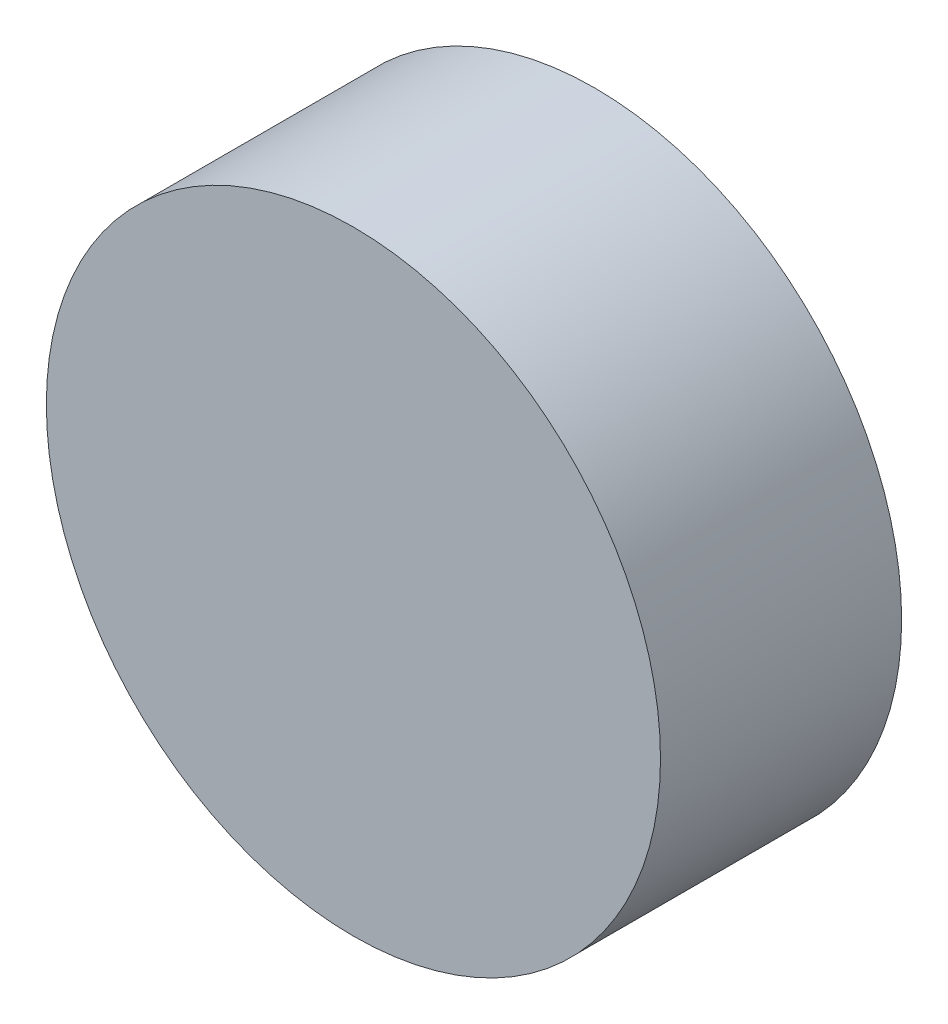
ISO-10303-21;
HEADER;
FILE_DESCRIPTION(('STEP AP214'),'2;1');
FILE_NAME('part.step','',(''),(''),'','','');
FILE_SCHEMA(('AUTOMOTIVE_DESIGN { 1 0 10303 214 1 1 1 1 }'));
ENDSEC;
DATA;
#1=APPLICATION_CONTEXT('core data for automotive mechanical design processes');
#2=APPLICATION_PROTOCOL_DEFINITION('international standard','automotive_design',2000,#1);
#3=PRODUCT_CONTEXT('',#1,'mechanical');
#4=PRODUCT('Part','Part','',(#3));
#5=PRODUCT_RELATED_PRODUCT_CATEGORY('part','',(#4));
#6=PRODUCT_DEFINITION_FORMATION('','',#4);
#7=PRODUCT_DEFINITION_CONTEXT('part definition',#1,'design');
#8=PRODUCT_DEFINITION('design','',#6,#7);
#9=PRODUCT_DEFINITION_SHAPE('','',#8);
#10=(LENGTH_UNIT() NAMED_UNIT(*) SI_UNIT(.MILLI.,.METRE.));
#11=(NAMED_UNIT(*) PLANE_ANGLE_UNIT() SI_UNIT($,.RADIAN.));
#12=(NAMED_UNIT(*) SI_UNIT($,.STERADIAN.) SOLID_ANGLE_UNIT());
#13=UNCERTAINTY_MEASURE_WITH_UNIT(LENGTH_MEASURE(1.E-05),#10,'distance_accuracy_value','');
#14=(GEOMETRIC_REPRESENTATION_CONTEXT(3) GLOBAL_UNCERTAINTY_ASSIGNED_CONTEXT((#13)) GLOBAL_UNIT_ASSIGNED_CONTEXT((#10,
#11,#12)) REPRESENTATION_CONTEXT('',''));
#15=CARTESIAN_POINT('',(0.,0.,0.));
#16=DIRECTION('',(0.,0.,1.));
#17=DIRECTION('',(1.,0.,0.));
#18=AXIS2_PLACEMENT_3D('',#15,#16,#17);
#19=CARTESIAN_POINT('',(0.,0.,26.7));
#20=DIRECTION('',(0.,0.,-1.));
#21=DIRECTION('',(-1.,0.,0.));
#22=AXIS2_PLACEMENT_3D('',#19,#20,#21);
#23=CYLINDRICAL_SURFACE('',#22,34.);
#24=CARTESIAN_POINT('',(0.,0.,26.7));
#25=DIRECTION('',(0.,0.,1.));
#26=DIRECTION('',(1.,0.,0.));
#27=AXIS2_PLACEMENT_3D('',#24,#25,#26);
#28=CIRCLE('',#27,34.);
#29=CARTESIAN_POINT('',(34.,0.,26.7));
#30=VERTEX_POINT('',#29);
#31=EDGE_CURVE('E10',#30,#30,#28,.T.);
#32=ORIENTED_EDGE('',*,*,#31,.F.);
#33=EDGE_LOOP('',(#32));
#34=FACE_BOUND('',#33,.T.);
#35=CARTESIAN_POINT('',(0.,0.,0.));
#36=DIRECTION('',(0.,0.,1.));
#37=DIRECTION('',(1.,0.,0.));
#38=AXIS2_PLACEMENT_3D('',#35,#36,#37);
#39=CIRCLE('',#38,34.);
#40=CARTESIAN_POINT('',(34.,0.,0.));
#41=VERTEX_POINT('',#40);
#42=EDGE_CURVE('E40',#41,#41,#39,.T.);
#43=ORIENTED_EDGE('',*,*,#42,.T.);
#44=EDGE_LOOP('',(#43));
#45=FACE_BOUND('',#44,.T.);
#46=ADVANCED_FACE('F37',(#34,#45),#23,.T.);
#47=CARTESIAN_POINT('',(0.,0.,26.7));
#48=DIRECTION('',(0.,0.,1.));
#49=DIRECTION('',(1.,0.,0.));
#50=AXIS2_PLACEMENT_3D('',#47,#48,#49);
#51=PLANE('',#50);
#52=ORIENTED_EDGE('',*,*,#31,.T.);
#53=EDGE_LOOP('',(#52));
#54=FACE_BOUND('',#53,.T.);
#55=ADVANCED_FACE('F52',(#54),#51,.T.);
#56=CARTESIAN_POINT('',(0.,0.,0.));
#57=DIRECTION('',(0.,0.,1.));
#58=DIRECTION('',(1.,0.,0.));
#59=AXIS2_PLACEMENT_3D('',#56,#57,#58);
#60=PLANE('',#59);
#61=ORIENTED_EDGE('',*,*,#42,.F.);
#62=EDGE_LOOP('',(#61));
#63=FACE_BOUND('',#62,.T.);
#64=ADVANCED_FACE('F50',(#63),#60,.F.);
#65=CLOSED_SHELL('',(#46,#55,#64));
#66=MANIFOLD_SOLID_BREP('B2',#65);
#67=ADVANCED_BREP_SHAPE_REPRESENTATION('',(#18,#66),#14);
#68=SHAPE_DEFINITION_REPRESENTATION(#9,#67);
ENDSEC;
END-ISO-10303-21;
